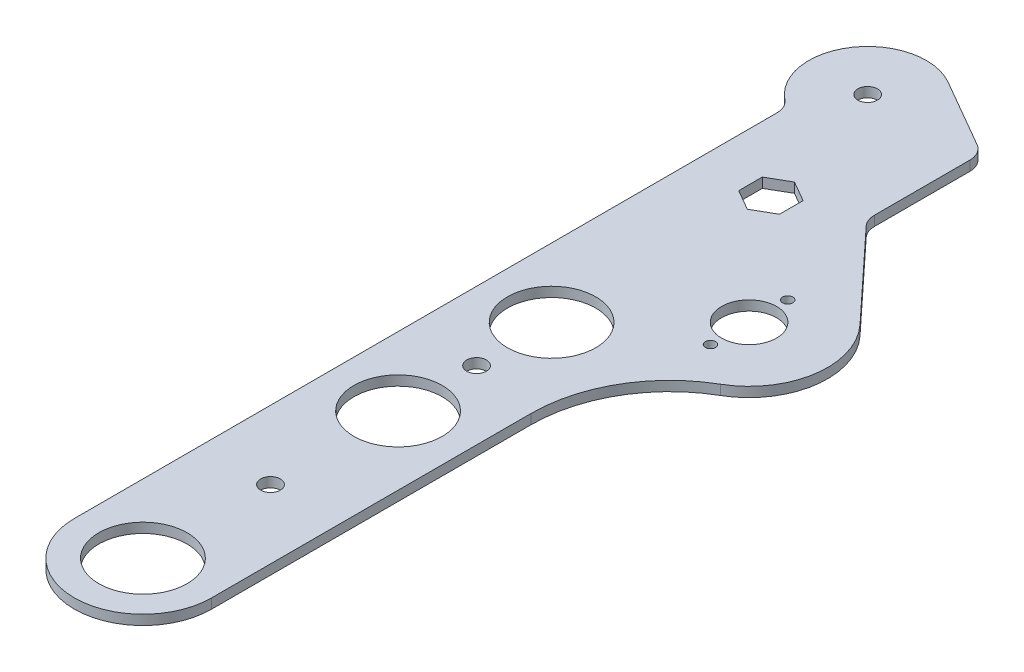
ISO-10303-21;
HEADER;
FILE_DESCRIPTION(('STEP AP214'),'2;1');
FILE_NAME('part.step','',(''),(''),'','','');
FILE_SCHEMA(('AUTOMOTIVE_DESIGN { 1 0 10303 214 1 1 1 1 }'));
ENDSEC;
DATA;
#1=APPLICATION_CONTEXT('core data for automotive mechanical design processes');
#2=APPLICATION_PROTOCOL_DEFINITION('international standard','automotive_design',2000,#1);
#3=PRODUCT_CONTEXT('',#1,'mechanical');
#4=PRODUCT('Part','Part','',(#3));
#5=PRODUCT_RELATED_PRODUCT_CATEGORY('part','',(#4));
#6=PRODUCT_DEFINITION_FORMATION('','',#4);
#7=PRODUCT_DEFINITION_CONTEXT('part definition',#1,'design');
#8=PRODUCT_DEFINITION('design','',#6,#7);
#9=PRODUCT_DEFINITION_SHAPE('','',#8);
#10=(LENGTH_UNIT() NAMED_UNIT(*) SI_UNIT(.MILLI.,.METRE.));
#11=(NAMED_UNIT(*) PLANE_ANGLE_UNIT() SI_UNIT($,.RADIAN.));
#12=(NAMED_UNIT(*) SI_UNIT($,.STERADIAN.) SOLID_ANGLE_UNIT());
#13=UNCERTAINTY_MEASURE_WITH_UNIT(LENGTH_MEASURE(1.E-05),#10,'distance_accuracy_value','');
#14=(GEOMETRIC_REPRESENTATION_CONTEXT(3) GLOBAL_UNCERTAINTY_ASSIGNED_CONTEXT((#13)) GLOBAL_UNIT_ASSIGNED_CONTEXT((#10,
#11,#12)) REPRESENTATION_CONTEXT('',''));
#15=CARTESIAN_POINT('',(0.,0.,0.));
#16=DIRECTION('',(0.,0.,1.));
#17=DIRECTION('',(1.,0.,0.));
#18=AXIS2_PLACEMENT_3D('',#15,#16,#17);
#19=CARTESIAN_POINT('',(2.25425,3.175,-3.90447553296214));
#20=DIRECTION('',(0.5,0.,-0.866025403784439));
#21=DIRECTION('',(-0.866025403784439,0.,-0.5));
#22=AXIS2_PLACEMENT_3D('',#19,#20,#21);
#23=PLANE('',#22);
#24=DIRECTION('',(0.866025403784439,0.,0.5));
#25=VECTOR('',#24,1.);
#26=CARTESIAN_POINT('',(2.25425,0.,-3.90447553296214));
#27=LINE('',#26,#25);
#28=CARTESIAN_POINT('',(15.621,0.,3.81282117772829));
#29=VERTEX_POINT('',#28);
#30=CARTESIAN_POINT('',(22.225,0.,7.62564235545658));
#31=VERTEX_POINT('',#30);
#32=EDGE_CURVE('E291',#29,#31,#27,.T.);
#33=ORIENTED_EDGE('',*,*,#32,.F.);
#34=DIRECTION('',(0.,-1.,0.));
#35=VECTOR('',#34,1.);
#36=CARTESIAN_POINT('',(15.621,3.175,3.81282117772829));
#37=LINE('',#36,#35);
#38=CARTESIAN_POINT('',(15.621,3.175,3.81282117772829));
#39=VERTEX_POINT('',#38);
#40=EDGE_CURVE('E11',#39,#29,#37,.T.);
#41=ORIENTED_EDGE('',*,*,#40,.F.);
#42=DIRECTION('',(0.866025403784439,0.,0.5));
#43=VECTOR('',#42,1.);
#44=CARTESIAN_POINT('',(2.25425,3.175,-3.90447553296214));
#45=LINE('',#44,#43);
#46=CARTESIAN_POINT('',(22.225,3.175,7.62564235545658));
#47=VERTEX_POINT('',#46);
#48=EDGE_CURVE('E673',#39,#47,#45,.T.);
#49=ORIENTED_EDGE('',*,*,#48,.T.);
#50=DIRECTION('',(0.,-1.,0.));
#51=VECTOR('',#50,1.);
#52=CARTESIAN_POINT('',(22.225,3.175,7.62564235545658));
#53=LINE('',#52,#51);
#54=EDGE_CURVE('E61',#47,#31,#53,.T.);
#55=ORIENTED_EDGE('',*,*,#54,.T.);
#56=EDGE_LOOP('',(#33,#41,#49,#55));
#57=FACE_BOUND('',#56,.T.);
#58=ADVANCED_FACE('F41',(#57),#23,.T.);
#59=CARTESIAN_POINT('',(15.621,3.175,0.));
#60=DIRECTION('',(1.,0.,0.));
#61=DIRECTION('',(0.,0.,-1.));
#62=AXIS2_PLACEMENT_3D('',#59,#60,#61);
#63=PLANE('',#62);
#64=DIRECTION('',(0.,0.,1.));
#65=VECTOR('',#64,1.);
#66=CARTESIAN_POINT('',(15.621,0.,0.));
#67=LINE('',#66,#65);
#68=CARTESIAN_POINT('',(15.621,0.,-3.81282117772829));
#69=VERTEX_POINT('',#68);
#70=EDGE_CURVE('E294',#69,#29,#67,.T.);
#71=ORIENTED_EDGE('',*,*,#70,.F.);
#72=DIRECTION('',(0.,-1.,0.));
#73=VECTOR('',#72,1.);
#74=CARTESIAN_POINT('',(15.621,3.175,-3.81282117772829));
#75=LINE('',#74,#73);
#76=CARTESIAN_POINT('',(15.621,3.175,-3.81282117772829));
#77=VERTEX_POINT('',#76);
#78=EDGE_CURVE('E52',#77,#69,#75,.T.);
#79=ORIENTED_EDGE('',*,*,#78,.F.);
#80=DIRECTION('',(0.,0.,1.));
#81=VECTOR('',#80,1.);
#82=CARTESIAN_POINT('',(15.621,3.175,0.));
#83=LINE('',#82,#81);
#84=EDGE_CURVE('E675',#77,#39,#83,.T.);
#85=ORIENTED_EDGE('',*,*,#84,.T.);
#86=ORIENTED_EDGE('',*,*,#40,.T.);
#87=EDGE_LOOP('',(#71,#79,#85,#86));
#88=FACE_BOUND('',#87,.T.);
#89=ADVANCED_FACE('F424',(#88),#63,.T.);
#90=CARTESIAN_POINT('',(2.25425,3.175,3.90447553296214));
#91=DIRECTION('',(0.5,0.,0.866025403784439));
#92=DIRECTION('',(0.866025403784439,0.,-0.5));
#93=AXIS2_PLACEMENT_3D('',#90,#91,#92);
#94=PLANE('',#93);
#95=DIRECTION('',(-0.866025403784439,0.,0.5));
#96=VECTOR('',#95,1.);
#97=CARTESIAN_POINT('',(2.25425,0.,3.90447553296214));
#98=LINE('',#97,#96);
#99=CARTESIAN_POINT('',(22.225,0.,-7.62564235545658));
#100=VERTEX_POINT('',#99);
#101=EDGE_CURVE('E298',#100,#69,#98,.T.);
#102=ORIENTED_EDGE('',*,*,#101,.F.);
#103=DIRECTION('',(0.,-1.,0.));
#104=VECTOR('',#103,1.);
#105=CARTESIAN_POINT('',(22.225,3.175,-7.62564235545658));
#106=LINE('',#105,#104);
#107=CARTESIAN_POINT('',(22.225,3.175,-7.62564235545658));
#108=VERTEX_POINT('',#107);
#109=EDGE_CURVE('E184',#108,#100,#106,.T.);
#110=ORIENTED_EDGE('',*,*,#109,.F.);
#111=DIRECTION('',(-0.866025403784439,0.,0.5));
#112=VECTOR('',#111,1.);
#113=CARTESIAN_POINT('',(2.25425,3.175,3.90447553296214));
#114=LINE('',#113,#112);
#115=EDGE_CURVE('E195',#108,#77,#114,.T.);
#116=ORIENTED_EDGE('',*,*,#115,.T.);
#117=ORIENTED_EDGE('',*,*,#78,.T.);
#118=EDGE_LOOP('',(#102,#110,#116,#117));
#119=FACE_BOUND('',#118,.T.);
#120=ADVANCED_FACE('F429',(#119),#94,.T.);
#121=CARTESIAN_POINT('',(8.85825000000001,3.175,-15.342939066147));
#122=DIRECTION('',(-0.5,0.,0.866025403784438));
#123=DIRECTION('',(0.866025403784439,0.,0.5));
#124=AXIS2_PLACEMENT_3D('',#121,#122,#123);
#125=PLANE('',#124);
#126=DIRECTION('',(-0.866025403784439,0.,-0.5));
#127=VECTOR('',#126,1.);
#128=CARTESIAN_POINT('',(8.85825000000001,0.,-15.342939066147));
#129=LINE('',#128,#127);
#130=CARTESIAN_POINT('',(28.829,0.,-3.81282117772829));
#131=VERTEX_POINT('',#130);
#132=EDGE_CURVE('E179',#131,#100,#129,.T.);
#133=ORIENTED_EDGE('',*,*,#132,.F.);
#134=DIRECTION('',(0.,-1.,0.));
#135=VECTOR('',#134,1.);
#136=CARTESIAN_POINT('',(28.829,3.175,-3.81282117772829));
#137=LINE('',#136,#135);
#138=CARTESIAN_POINT('',(28.829,3.175,-3.81282117772829));
#139=VERTEX_POINT('',#138);
#140=EDGE_CURVE('E174',#139,#131,#137,.T.);
#141=ORIENTED_EDGE('',*,*,#140,.F.);
#142=DIRECTION('',(-0.866025403784439,0.,-0.5));
#143=VECTOR('',#142,1.);
#144=CARTESIAN_POINT('',(8.85825000000001,3.175,-15.342939066147));
#145=LINE('',#144,#143);
#146=EDGE_CURVE('E177',#139,#108,#145,.T.);
#147=ORIENTED_EDGE('',*,*,#146,.T.);
#148=ORIENTED_EDGE('',*,*,#109,.T.);
#149=EDGE_LOOP('',(#133,#141,#147,#148));
#150=FACE_BOUND('',#149,.T.);
#151=ADVANCED_FACE('F176',(#150),#125,.T.);
#152=CARTESIAN_POINT('',(28.829,3.175,0.));
#153=DIRECTION('',(-1.,0.,0.));
#154=DIRECTION('',(0.,0.,1.));
#155=AXIS2_PLACEMENT_3D('',#152,#153,#154);
#156=PLANE('',#155);
#157=DIRECTION('',(0.,0.,-1.));
#158=VECTOR('',#157,1.);
#159=CARTESIAN_POINT('',(28.829,0.,0.));
#160=LINE('',#159,#158);
#161=CARTESIAN_POINT('',(28.829,0.,3.81282117772829));
#162=VERTEX_POINT('',#161);
#163=EDGE_CURVE('E304',#162,#131,#160,.T.);
#164=ORIENTED_EDGE('',*,*,#163,.F.);
#165=DIRECTION('',(0.,-1.,0.));
#166=VECTOR('',#165,1.);
#167=CARTESIAN_POINT('',(28.829,3.175,3.81282117772829));
#168=LINE('',#167,#166);
#169=CARTESIAN_POINT('',(28.829,3.175,3.81282117772829));
#170=VERTEX_POINT('',#169);
#171=EDGE_CURVE('E116',#170,#162,#168,.T.);
#172=ORIENTED_EDGE('',*,*,#171,.F.);
#173=DIRECTION('',(0.,0.,-1.));
#174=VECTOR('',#173,1.);
#175=CARTESIAN_POINT('',(28.829,3.175,0.));
#176=LINE('',#175,#174);
#177=EDGE_CURVE('E192',#170,#139,#176,.T.);
#178=ORIENTED_EDGE('',*,*,#177,.T.);
#179=ORIENTED_EDGE('',*,*,#140,.T.);
#180=EDGE_LOOP('',(#164,#172,#178,#179));
#181=FACE_BOUND('',#180,.T.);
#182=ADVANCED_FACE('F198',(#181),#156,.T.);
#183=CARTESIAN_POINT('',(50.8,3.175,-11.2344473454038));
#184=DIRECTION('',(0.,-1.,0.));
#185=DIRECTION('',(0.,0.,-1.));
#186=AXIS2_PLACEMENT_3D('',#183,#184,#185);
#187=CYLINDRICAL_SURFACE('',#186,6.34999999999999);
#188=CARTESIAN_POINT('',(50.8,0.,-11.2344473454038));
#189=DIRECTION('',(0.,1.,0.));
#190=DIRECTION('',(0.,0.,1.));
#191=AXIS2_PLACEMENT_3D('',#188,#189,#190);
#192=CIRCLE('',#191,6.34999999999999);
#193=CARTESIAN_POINT('',(44.45,0.,-11.2344473454038));
#194=VERTEX_POINT('',#193);
#195=CARTESIAN_POINT('',(46.1502533204846,0.,-6.90982530222635));
#196=VERTEX_POINT('',#195);
#197=EDGE_CURVE('E215',#194,#196,#192,.T.);
#198=ORIENTED_EDGE('',*,*,#197,.F.);
#199=DIRECTION('',(0.,-1.,0.));
#200=VECTOR('',#199,1.);
#201=CARTESIAN_POINT('',(44.45,3.175,-11.2344473454038));
#202=LINE('',#201,#200);
#203=CARTESIAN_POINT('',(44.45,3.175,-11.2344473454038));
#204=VERTEX_POINT('',#203);
#205=EDGE_CURVE('E45',#204,#194,#202,.T.);
#206=ORIENTED_EDGE('',*,*,#205,.F.);
#207=CARTESIAN_POINT('',(50.8,3.175,-11.2344473454038));
#208=DIRECTION('',(0.,1.,0.));
#209=DIRECTION('',(0.,0.,1.));
#210=AXIS2_PLACEMENT_3D('',#207,#208,#209);
#211=CIRCLE('',#210,6.34999999999999);
#212=CARTESIAN_POINT('',(46.1502533204846,3.175,-6.90982530222635));
#213=VERTEX_POINT('',#212);
#214=EDGE_CURVE('E367',#204,#213,#211,.T.);
#215=ORIENTED_EDGE('',*,*,#214,.T.);
#216=DIRECTION('',(0.,-1.,0.));
#217=VECTOR('',#216,1.);
#218=CARTESIAN_POINT('',(46.1502533204846,3.175,-6.90982530222635));
#219=LINE('',#218,#217);
#220=EDGE_CURVE('E203',#213,#196,#219,.T.);
#221=ORIENTED_EDGE('',*,*,#220,.T.);
#222=EDGE_LOOP('',(#198,#206,#215,#221));
#223=FACE_BOUND('',#222,.T.);
#224=ADVANCED_FACE('F365',(#223),#187,.F.);
#225=CARTESIAN_POINT('',(44.45,3.175,0.));
#226=DIRECTION('',(-1.,0.,0.));
#227=DIRECTION('',(0.,0.,1.));
#228=AXIS2_PLACEMENT_3D('',#225,#226,#227);
#229=PLANE('',#228);
#230=DIRECTION('',(0.,0.,-1.));
#231=VECTOR('',#230,1.);
#232=CARTESIAN_POINT('',(44.45,0.,0.));
#233=LINE('',#232,#231);
#234=CARTESIAN_POINT('',(44.45,0.,-42.1610034075734));
#235=VERTEX_POINT('',#234);
#236=EDGE_CURVE('E219',#194,#235,#233,.T.);
#237=ORIENTED_EDGE('',*,*,#236,.T.);
#238=DIRECTION('',(0.,-1.,0.));
#239=VECTOR('',#238,1.);
#240=CARTESIAN_POINT('',(44.45,3.175,-42.1610034075734));
#241=LINE('',#240,#239);
#242=CARTESIAN_POINT('',(44.45,3.175,-42.1610034075734));
#243=VERTEX_POINT('',#242);
#244=EDGE_CURVE('E350',#243,#235,#241,.T.);
#245=ORIENTED_EDGE('',*,*,#244,.F.);
#246=DIRECTION('',(0.,0.,-1.));
#247=VECTOR('',#246,1.);
#248=CARTESIAN_POINT('',(44.45,3.175,0.));
#249=LINE('',#248,#247);
#250=EDGE_CURVE('E360',#204,#243,#249,.T.);
#251=ORIENTED_EDGE('',*,*,#250,.F.);
#252=ORIENTED_EDGE('',*,*,#205,.T.);
#253=EDGE_LOOP('',(#237,#245,#251,#252));
#254=FACE_BOUND('',#253,.T.);
#255=ADVANCED_FACE('F359',(#254),#229,.F.);
#256=CARTESIAN_POINT('',(38.1,3.175,-42.1610034075734));
#257=DIRECTION('',(0.,-1.,0.));
#258=DIRECTION('',(0.,0.,-1.));
#259=AXIS2_PLACEMENT_3D('',#256,#257,#258);
#260=CYLINDRICAL_SURFACE('',#259,6.35);
#261=CARTESIAN_POINT('',(38.1,0.,-42.1610034075734));
#262=DIRECTION('',(0.,1.,0.));
#263=DIRECTION('',(0.,0.,1.));
#264=AXIS2_PLACEMENT_3D('',#261,#262,#263);
#265=CIRCLE('',#264,6.35);
#266=CARTESIAN_POINT('',(41.2749999999998,0.,-47.6602647216047));
#267=VERTEX_POINT('',#266);
#268=EDGE_CURVE('E223',#267,#235,#265,.F.);
#269=ORIENTED_EDGE('',*,*,#268,.F.);
#270=DIRECTION('',(0.,-1.,0.));
#271=VECTOR('',#270,1.);
#272=CARTESIAN_POINT('',(41.2749999999998,3.175,-47.6602647216047));
#273=LINE('',#272,#271);
#274=CARTESIAN_POINT('',(41.2749999999998,3.175,-47.6602647216047));
#275=VERTEX_POINT('',#274);
#276=EDGE_CURVE('E348',#275,#267,#273,.T.);
#277=ORIENTED_EDGE('',*,*,#276,.F.);
#278=CARTESIAN_POINT('',(38.1,3.175,-42.1610034075734));
#279=DIRECTION('',(0.,1.,0.));
#280=DIRECTION('',(0.,0.,1.));
#281=AXIS2_PLACEMENT_3D('',#278,#279,#280);
#282=CIRCLE('',#281,6.35);
#283=EDGE_CURVE('E733',#275,#243,#282,.F.);
#284=ORIENTED_EDGE('',*,*,#283,.T.);
#285=ORIENTED_EDGE('',*,*,#244,.T.);
#286=EDGE_LOOP('',(#269,#277,#284,#285));
#287=FACE_BOUND('',#286,.T.);
#288=ADVANCED_FACE('F413',(#287),#260,.T.);
#289=CARTESIAN_POINT('',(30.9562499999988,3.175,-53.6177978118054));
#290=DIRECTION('',(0.499999999999976,0.,-0.866025403784452));
#291=DIRECTION('',(-0.866025403784453,0.,-0.499999999999976));
#292=AXIS2_PLACEMENT_3D('',#289,#290,#291);
#293=PLANE('',#292);
#294=DIRECTION('',(0.866025403784452,0.,0.499999999999976));
#295=VECTOR('',#294,1.);
#296=CARTESIAN_POINT('',(30.9562499999988,0.,-53.6177978118054));
#297=LINE('',#296,#295);
#298=CARTESIAN_POINT('',(19.0499999999991,0.,-60.4918744543437));
#299=VERTEX_POINT('',#298);
#300=EDGE_CURVE('E227',#299,#267,#297,.T.);
#301=ORIENTED_EDGE('',*,*,#300,.F.);
#302=DIRECTION('',(0.,-1.,0.));
#303=VECTOR('',#302,1.);
#304=CARTESIAN_POINT('',(19.0499999999991,3.175,-60.4918744543437));
#305=LINE('',#304,#303);
#306=CARTESIAN_POINT('',(19.0499999999991,3.175,-60.4918744543437));
#307=VERTEX_POINT('',#306);
#308=EDGE_CURVE('E345',#307,#299,#305,.T.);
#309=ORIENTED_EDGE('',*,*,#308,.F.);
#310=DIRECTION('',(0.866025403784452,0.,0.499999999999976));
#311=VECTOR('',#310,1.);
#312=CARTESIAN_POINT('',(30.9562499999988,3.175,-53.6177978118054));
#313=LINE('',#312,#311);
#314=EDGE_CURVE('E411',#307,#275,#313,.T.);
#315=ORIENTED_EDGE('',*,*,#314,.T.);
#316=ORIENTED_EDGE('',*,*,#276,.T.);
#317=EDGE_LOOP('',(#301,#309,#315,#316));
#318=FACE_BOUND('',#317,.T.);
#319=ADVANCED_FACE('F407',(#318),#293,.T.);
#320=CARTESIAN_POINT('',(9.52499999999954,3.175,-43.9940905122499));
#321=DIRECTION('',(0.,-1.,0.));
#322=DIRECTION('',(0.,0.,-1.));
#323=AXIS2_PLACEMENT_3D('',#320,#321,#322);
#324=CYLINDRICAL_SURFACE('',#323,19.0499999999996);
#325=CARTESIAN_POINT('',(9.52499999999954,0.,-43.9940905122499));
#326=DIRECTION('',(0.,1.,0.));
#327=DIRECTION('',(0.,0.,1.));
#328=AXIS2_PLACEMENT_3D('',#325,#326,#327);
#329=CIRCLE('',#328,19.0499999999996);
#330=CARTESIAN_POINT('',(-2.38125000000024,0.,-29.1231890285641));
#331=VERTEX_POINT('',#330);
#332=EDGE_CURVE('E231',#299,#331,#329,.T.);
#333=ORIENTED_EDGE('',*,*,#332,.T.);
#334=DIRECTION('',(0.,-1.,0.));
#335=VECTOR('',#334,1.);
#336=CARTESIAN_POINT('',(-2.38125000000024,3.175,-29.1231890285641));
#337=LINE('',#336,#335);
#338=CARTESIAN_POINT('',(-2.38125000000024,3.175,-29.1231890285641));
#339=VERTEX_POINT('',#338);
#340=EDGE_CURVE('E342',#339,#331,#337,.T.);
#341=ORIENTED_EDGE('',*,*,#340,.F.);
#342=CARTESIAN_POINT('',(9.52499999999954,3.175,-43.9940905122499));
#343=DIRECTION('',(0.,1.,0.));
#344=DIRECTION('',(0.,0.,1.));
#345=AXIS2_PLACEMENT_3D('',#342,#343,#344);
#346=CIRCLE('',#345,19.0499999999996);
#347=EDGE_CURVE('E728',#307,#339,#346,.T.);
#348=ORIENTED_EDGE('',*,*,#347,.F.);
#349=ORIENTED_EDGE('',*,*,#308,.T.);
#350=EDGE_LOOP('',(#333,#341,#348,#349));
#351=FACE_BOUND('',#350,.T.);
#352=ADVANCED_FACE('F420',(#351),#324,.T.);
#353=CARTESIAN_POINT('',(-6.35000000000001,3.175,-24.1662218673356));
#354=DIRECTION('',(0.,-1.,0.));
#355=DIRECTION('',(0.,0.,-1.));
#356=AXIS2_PLACEMENT_3D('',#353,#354,#355);
#357=CYLINDRICAL_SURFACE('',#356,6.35);
#358=CARTESIAN_POINT('',(-6.35000000000001,0.,-24.1662218673356));
#359=DIRECTION('',(0.,1.,0.));
#360=DIRECTION('',(0.,0.,1.));
#361=AXIS2_PLACEMENT_3D('',#358,#359,#360);
#362=CIRCLE('',#361,6.35);
#363=CARTESIAN_POINT('',(0.,0.,-24.1662218673356));
#364=VERTEX_POINT('',#363);
#365=EDGE_CURVE('E235',#364,#331,#362,.T.);
#366=ORIENTED_EDGE('',*,*,#365,.F.);
#367=DIRECTION('',(0.,-1.,0.));
#368=VECTOR('',#367,1.);
#369=CARTESIAN_POINT('',(0.,3.175,-24.1662218673356));
#370=LINE('',#369,#368);
#371=CARTESIAN_POINT('',(0.,3.175,-24.1662218673356));
#372=VERTEX_POINT('',#371);
#373=EDGE_CURVE('E339',#372,#364,#370,.T.);
#374=ORIENTED_EDGE('',*,*,#373,.F.);
#375=CARTESIAN_POINT('',(-6.35000000000001,3.175,-24.1662218673356));
#376=DIRECTION('',(0.,1.,0.));
#377=DIRECTION('',(0.,0.,1.));
#378=AXIS2_PLACEMENT_3D('',#375,#376,#377);
#379=CIRCLE('',#378,6.35);
#380=EDGE_CURVE('E401',#372,#339,#379,.T.);
#381=ORIENTED_EDGE('',*,*,#380,.T.);
#382=ORIENTED_EDGE('',*,*,#340,.T.);
#383=EDGE_LOOP('',(#366,#374,#381,#382));
#384=FACE_BOUND('',#383,.T.);
#385=ADVANCED_FACE('F400',(#384),#357,.F.);
#386=CARTESIAN_POINT('',(0.,3.175,0.));
#387=DIRECTION('',(1.,0.,0.));
#388=DIRECTION('',(0.,0.,-1.));
#389=AXIS2_PLACEMENT_3D('',#386,#387,#388);
#390=PLANE('',#389);
#391=DIRECTION('',(0.,0.,1.));
#392=VECTOR('',#391,1.);
#393=CARTESIAN_POINT('',(0.,0.,0.));
#394=LINE('',#393,#392);
#395=CARTESIAN_POINT('',(0.,0.,203.2));
#396=VERTEX_POINT('',#395);
#397=EDGE_CURVE('E239',#364,#396,#394,.T.);
#398=ORIENTED_EDGE('',*,*,#397,.T.);
#399=DIRECTION('',(0.,-1.,0.));
#400=VECTOR('',#399,1.);
#401=CARTESIAN_POINT('',(0.,3.175,203.2));
#402=LINE('',#401,#400);
#403=CARTESIAN_POINT('',(0.,3.175,203.2));
#404=VERTEX_POINT('',#403);
#405=EDGE_CURVE('E335',#404,#396,#402,.T.);
#406=ORIENTED_EDGE('',*,*,#405,.F.);
#407=DIRECTION('',(0.,0.,1.));
#408=VECTOR('',#407,1.);
#409=CARTESIAN_POINT('',(0.,3.175,0.));
#410=LINE('',#409,#408);
#411=EDGE_CURVE('E396',#372,#404,#410,.T.);
#412=ORIENTED_EDGE('',*,*,#411,.F.);
#413=ORIENTED_EDGE('',*,*,#373,.T.);
#414=EDGE_LOOP('',(#398,#406,#412,#413));
#415=FACE_BOUND('',#414,.T.);
#416=ADVANCED_FACE('F395',(#415),#390,.F.);
#417=CARTESIAN_POINT('',(22.225,3.175,203.2));
#418=DIRECTION('',(0.,-1.,0.));
#419=DIRECTION('',(0.,0.,-1.));
#420=AXIS2_PLACEMENT_3D('',#417,#418,#419);
#421=CYLINDRICAL_SURFACE('',#420,22.225);
#422=CARTESIAN_POINT('',(22.225,0.,203.2));
#423=DIRECTION('',(0.,1.,0.));
#424=DIRECTION('',(0.,0.,1.));
#425=AXIS2_PLACEMENT_3D('',#422,#423,#424);
#426=CIRCLE('',#425,22.225);
#427=CARTESIAN_POINT('',(44.45,0.,203.2));
#428=VERTEX_POINT('',#427);
#429=EDGE_CURVE('E243',#396,#428,#426,.T.);
#430=ORIENTED_EDGE('',*,*,#429,.T.);
#431=DIRECTION('',(0.,-1.,0.));
#432=VECTOR('',#431,1.);
#433=CARTESIAN_POINT('',(44.45,3.175,203.2));
#434=LINE('',#433,#432);
#435=CARTESIAN_POINT('',(44.45,3.175,203.2));
#436=VERTEX_POINT('',#435);
#437=EDGE_CURVE('E332',#436,#428,#434,.T.);
#438=ORIENTED_EDGE('',*,*,#437,.F.);
#439=CARTESIAN_POINT('',(22.225,3.175,203.2));
#440=DIRECTION('',(0.,1.,0.));
#441=DIRECTION('',(0.,0.,1.));
#442=AXIS2_PLACEMENT_3D('',#439,#440,#441);
#443=CIRCLE('',#442,22.225);
#444=EDGE_CURVE('E391',#404,#436,#443,.T.);
#445=ORIENTED_EDGE('',*,*,#444,.F.);
#446=ORIENTED_EDGE('',*,*,#405,.T.);
#447=EDGE_LOOP('',(#430,#438,#445,#446));
#448=FACE_BOUND('',#447,.T.);
#449=ADVANCED_FACE('F390',(#448),#421,.T.);
#450=CARTESIAN_POINT('',(44.4499999999999,3.175,0.));
#451=DIRECTION('',(1.,0.,0.));
#452=DIRECTION('',(0.,0.,-1.));
#453=AXIS2_PLACEMENT_3D('',#450,#451,#452);
#454=PLANE('',#453);
#455=DIRECTION('',(0.,0.,1.));
#456=VECTOR('',#455,1.);
#457=CARTESIAN_POINT('',(44.4499999999999,0.,0.));
#458=LINE('',#457,#456);
#459=CARTESIAN_POINT('',(44.45,0.,99.8571666408903));
#460=VERTEX_POINT('',#459);
#461=EDGE_CURVE('E247',#460,#428,#458,.T.);
#462=ORIENTED_EDGE('',*,*,#461,.F.);
#463=DIRECTION('',(0.,-1.,0.));
#464=VECTOR('',#463,1.);
#465=CARTESIAN_POINT('',(44.45,3.175,99.8571666408903));
#466=LINE('',#465,#464);
#467=CARTESIAN_POINT('',(44.45,3.175,99.8571666408903));
#468=VERTEX_POINT('',#467);
#469=EDGE_CURVE('E329',#468,#460,#466,.T.);
#470=ORIENTED_EDGE('',*,*,#469,.F.);
#471=DIRECTION('',(0.,0.,1.));
#472=VECTOR('',#471,1.);
#473=CARTESIAN_POINT('',(44.4499999999999,3.175,0.));
#474=LINE('',#473,#472);
#475=EDGE_CURVE('E719',#468,#436,#474,.T.);
#476=ORIENTED_EDGE('',*,*,#475,.T.);
#477=ORIENTED_EDGE('',*,*,#437,.T.);
#478=EDGE_LOOP('',(#462,#470,#476,#477));
#479=FACE_BOUND('',#478,.T.);
#480=ADVANCED_FACE('F384',(#479),#454,.T.);
#481=CARTESIAN_POINT('',(89.3035025575279,3.175,99.8571666408903));
#482=DIRECTION('',(0.,-1.,0.));
#483=DIRECTION('',(0.,0.,-1.));
#484=AXIS2_PLACEMENT_3D('',#481,#482,#483);
#485=CYLINDRICAL_SURFACE('',#484,44.8535025575279);
#486=CARTESIAN_POINT('',(89.3035025575279,0.,99.8571666408903));
#487=DIRECTION('',(0.,1.,0.));
#488=DIRECTION('',(0.,0.,1.));
#489=AXIS2_PLACEMENT_3D('',#486,#487,#488);
#490=CIRCLE('',#489,44.8535025575279);
#491=CARTESIAN_POINT('',(66.876751278764,0.,61.0128939773608));
#492=VERTEX_POINT('',#491);
#493=EDGE_CURVE('E251',#492,#460,#490,.T.);
#494=ORIENTED_EDGE('',*,*,#493,.F.);
#495=DIRECTION('',(0.,-1.,0.));
#496=VECTOR('',#495,1.);
#497=CARTESIAN_POINT('',(66.876751278764,3.175,61.0128939773608));
#498=LINE('',#497,#496);
#499=CARTESIAN_POINT('',(66.876751278764,3.175,61.0128939773608));
#500=VERTEX_POINT('',#499);
#501=EDGE_CURVE('E326',#500,#492,#498,.T.);
#502=ORIENTED_EDGE('',*,*,#501,.F.);
#503=CARTESIAN_POINT('',(89.3035025575279,3.175,99.8571666408903));
#504=DIRECTION('',(0.,1.,0.));
#505=DIRECTION('',(0.,0.,1.));
#506=AXIS2_PLACEMENT_3D('',#503,#504,#505);
#507=CIRCLE('',#506,44.8535025575279);
#508=EDGE_CURVE('E380',#500,#468,#507,.T.);
#509=ORIENTED_EDGE('',*,*,#508,.T.);
#510=ORIENTED_EDGE('',*,*,#469,.T.);
#511=EDGE_LOOP('',(#494,#502,#509,#510));
#512=FACE_BOUND('',#511,.T.);
#513=ADVANCED_FACE('F375',(#512),#485,.F.);
#514=CARTESIAN_POINT('',(54.1767512787641,3.175,39.015848721236));
#515=DIRECTION('',(0.,-1.,0.));
#516=DIRECTION('',(0.,0.,-1.));
#517=AXIS2_PLACEMENT_3D('',#514,#515,#516);
#518=CYLINDRICAL_SURFACE('',#517,25.4);
#519=CARTESIAN_POINT('',(54.1767512787641,0.,39.015848721236));
#520=DIRECTION('',(0.,1.,0.));
#521=DIRECTION('',(0.,0.,1.));
#522=AXIS2_PLACEMENT_3D('',#519,#520,#521);
#523=CIRCLE('',#522,25.4);
#524=CARTESIAN_POINT('',(72.7757379968254,0.,21.7173605485263));
#525=VERTEX_POINT('',#524);
#526=EDGE_CURVE('E255',#492,#525,#523,.T.);
#527=ORIENTED_EDGE('',*,*,#526,.T.);
#528=DIRECTION('',(0.,-1.,0.));
#529=VECTOR('',#528,1.);
#530=CARTESIAN_POINT('',(72.7757379968254,3.175,21.7173605485263));
#531=LINE('',#530,#529);
#532=CARTESIAN_POINT('',(72.7757379968254,3.175,21.7173605485263));
#533=VERTEX_POINT('',#532);
#534=EDGE_CURVE('E322',#533,#525,#531,.T.);
#535=ORIENTED_EDGE('',*,*,#534,.F.);
#536=CARTESIAN_POINT('',(54.1767512787641,3.175,39.015848721236));
#537=DIRECTION('',(0.,1.,0.));
#538=DIRECTION('',(0.,0.,1.));
#539=AXIS2_PLACEMENT_3D('',#536,#537,#538);
#540=CIRCLE('',#539,25.4);
#541=EDGE_CURVE('E713',#500,#533,#540,.T.);
#542=ORIENTED_EDGE('',*,*,#541,.F.);
#543=ORIENTED_EDGE('',*,*,#501,.T.);
#544=EDGE_LOOP('',(#527,#535,#542,#543));
#545=FACE_BOUND('',#544,.T.);
#546=ADVANCED_FACE('F438',(#545),#518,.T.);
#547=CARTESIAN_POINT('',(22.225,3.175,203.2));
#548=DIRECTION('',(0.,-1.,0.));
#549=DIRECTION('',(0.,0.,-1.));
#550=AXIS2_PLACEMENT_3D('',#547,#548,#549);
#551=CYLINDRICAL_SURFACE('',#550,14.2875);
#552=CARTESIAN_POINT('',(22.225,3.175,203.2));
#553=DIRECTION('',(0.,1.,0.));
#554=DIRECTION('',(0.,0.,1.));
#555=AXIS2_PLACEMENT_3D('',#552,#553,#554);
#556=CIRCLE('',#555,14.2875);
#557=CARTESIAN_POINT('',(22.225,3.175,217.4875));
#558=VERTEX_POINT('',#557);
#559=EDGE_CURVE('E677',#558,#558,#556,.T.);
#560=ORIENTED_EDGE('',*,*,#559,.T.);
#561=EDGE_LOOP('',(#560));
#562=FACE_BOUND('',#561,.T.);
#563=CARTESIAN_POINT('',(22.225,0.,203.2));
#564=DIRECTION('',(0.,1.,0.));
#565=DIRECTION('',(0.,0.,1.));
#566=AXIS2_PLACEMENT_3D('',#563,#564,#565);
#567=CIRCLE('',#566,14.2875);
#568=CARTESIAN_POINT('',(22.225,0.,217.4875));
#569=VERTEX_POINT('',#568);
#570=EDGE_CURVE('E287',#569,#569,#567,.T.);
#571=ORIENTED_EDGE('',*,*,#570,.F.);
#572=EDGE_LOOP('',(#571));
#573=FACE_BOUND('',#572,.T.);
#574=ADVANCED_FACE('F434',(#562,#573),#551,.F.);
#575=CARTESIAN_POINT('',(22.225,3.175,120.65));
#576=DIRECTION('',(0.,-1.,0.));
#577=DIRECTION('',(0.,0.,-1.));
#578=AXIS2_PLACEMENT_3D('',#575,#576,#577);
#579=CYLINDRICAL_SURFACE('',#578,14.2875);
#580=CARTESIAN_POINT('',(22.225,3.175,120.65));
#581=DIRECTION('',(0.,1.,0.));
#582=DIRECTION('',(0.,0.,1.));
#583=AXIS2_PLACEMENT_3D('',#580,#581,#582);
#584=CIRCLE('',#583,14.2875);
#585=CARTESIAN_POINT('',(22.225,3.175,134.9375));
#586=VERTEX_POINT('',#585);
#587=EDGE_CURVE('E686',#586,#586,#584,.T.);
#588=ORIENTED_EDGE('',*,*,#587,.T.);
#589=EDGE_LOOP('',(#588));
#590=FACE_BOUND('',#589,.T.);
#591=CARTESIAN_POINT('',(22.225,0.,120.65));
#592=DIRECTION('',(0.,1.,0.));
#593=DIRECTION('',(0.,0.,1.));
#594=AXIS2_PLACEMENT_3D('',#591,#592,#593);
#595=CIRCLE('',#594,14.2875);
#596=CARTESIAN_POINT('',(22.225,0.,134.9375));
#597=VERTEX_POINT('',#596);
#598=EDGE_CURVE('E283',#597,#597,#595,.T.);
#599=ORIENTED_EDGE('',*,*,#598,.F.);
#600=EDGE_LOOP('',(#599));
#601=FACE_BOUND('',#600,.T.);
#602=ADVANCED_FACE('F437',(#590,#601),#579,.F.);
#603=CARTESIAN_POINT('',(22.225,3.175,70.9676));
#604=DIRECTION('',(0.,-1.,0.));
#605=DIRECTION('',(0.,0.,-1.));
#606=AXIS2_PLACEMENT_3D('',#603,#604,#605);
#607=CYLINDRICAL_SURFACE('',#606,14.2875);
#608=CARTESIAN_POINT('',(22.225,3.175,70.9676));
#609=DIRECTION('',(0.,1.,0.));
#610=DIRECTION('',(0.,0.,1.));
#611=AXIS2_PLACEMENT_3D('',#608,#609,#610);
#612=CIRCLE('',#611,14.2875);
#613=CARTESIAN_POINT('',(22.225,3.175,85.2551));
#614=VERTEX_POINT('',#613);
#615=EDGE_CURVE('E690',#614,#614,#612,.T.);
#616=ORIENTED_EDGE('',*,*,#615,.T.);
#617=EDGE_LOOP('',(#616));
#618=FACE_BOUND('',#617,.T.);
#619=CARTESIAN_POINT('',(22.225,0.,70.9676));
#620=DIRECTION('',(0.,1.,0.));
#621=DIRECTION('',(0.,0.,1.));
#622=AXIS2_PLACEMENT_3D('',#619,#620,#621);
#623=CIRCLE('',#622,14.2875);
#624=CARTESIAN_POINT('',(22.225,0.,85.2551));
#625=VERTEX_POINT('',#624);
#626=EDGE_CURVE('E279',#625,#625,#623,.T.);
#627=ORIENTED_EDGE('',*,*,#626,.F.);
#628=EDGE_LOOP('',(#627));
#629=FACE_BOUND('',#628,.T.);
#630=ADVANCED_FACE('F442',(#618,#629),#607,.F.);
#631=CARTESIAN_POINT('',(22.2250000000001,3.175,95.25));
#632=DIRECTION('',(0.,-1.,0.));
#633=DIRECTION('',(0.,0.,-1.));
#634=AXIS2_PLACEMENT_3D('',#631,#632,#633);
#635=CYLINDRICAL_SURFACE('',#634,3.175);
#636=CARTESIAN_POINT('',(22.2250000000001,3.175,95.25));
#637=DIRECTION('',(0.,1.,0.));
#638=DIRECTION('',(0.,0.,1.));
#639=AXIS2_PLACEMENT_3D('',#636,#637,#638);
#640=CIRCLE('',#639,3.175);
#641=CARTESIAN_POINT('',(22.2250000000001,3.175,98.425));
#642=VERTEX_POINT('',#641);
#643=EDGE_CURVE('E694',#642,#642,#640,.T.);
#644=ORIENTED_EDGE('',*,*,#643,.T.);
#645=EDGE_LOOP('',(#644));
#646=FACE_BOUND('',#645,.T.);
#647=CARTESIAN_POINT('',(22.2250000000001,0.,95.25));
#648=DIRECTION('',(0.,1.,0.));
#649=DIRECTION('',(0.,0.,1.));
#650=AXIS2_PLACEMENT_3D('',#647,#648,#649);
#651=CIRCLE('',#650,3.175);
#652=CARTESIAN_POINT('',(22.2250000000001,0.,98.425));
#653=VERTEX_POINT('',#652);
#654=EDGE_CURVE('E275',#653,#653,#651,.T.);
#655=ORIENTED_EDGE('',*,*,#654,.F.);
#656=EDGE_LOOP('',(#655));
#657=FACE_BOUND('',#656,.T.);
#658=ADVANCED_FACE('F446',(#646,#657),#635,.F.);
#659=CARTESIAN_POINT('',(22.2250000000002,3.175,161.925));
#660=DIRECTION('',(0.,-1.,0.));
#661=DIRECTION('',(0.,0.,-1.));
#662=AXIS2_PLACEMENT_3D('',#659,#660,#661);
#663=CYLINDRICAL_SURFACE('',#662,3.175);
#664=CARTESIAN_POINT('',(22.2250000000002,3.175,161.925));
#665=DIRECTION('',(0.,1.,0.));
#666=DIRECTION('',(0.,0.,1.));
#667=AXIS2_PLACEMENT_3D('',#664,#665,#666);
#668=CIRCLE('',#667,3.175);
#669=CARTESIAN_POINT('',(22.2250000000002,3.175,165.1));
#670=VERTEX_POINT('',#669);
#671=EDGE_CURVE('E698',#670,#670,#668,.T.);
#672=ORIENTED_EDGE('',*,*,#671,.T.);
#673=EDGE_LOOP('',(#672));
#674=FACE_BOUND('',#673,.T.);
#675=CARTESIAN_POINT('',(22.2250000000002,0.,161.925));
#676=DIRECTION('',(0.,1.,0.));
#677=DIRECTION('',(0.,0.,1.));
#678=AXIS2_PLACEMENT_3D('',#675,#676,#677);
#679=CIRCLE('',#678,3.175);
#680=CARTESIAN_POINT('',(22.2250000000002,0.,165.1));
#681=VERTEX_POINT('',#680);
#682=EDGE_CURVE('E271',#681,#681,#679,.T.);
#683=ORIENTED_EDGE('',*,*,#682,.F.);
#684=EDGE_LOOP('',(#683));
#685=FACE_BOUND('',#684,.T.);
#686=ADVANCED_FACE('F450',(#674,#685),#663,.F.);
#687=CARTESIAN_POINT('',(9.52499999999954,3.175,-43.9940905122499));
#688=DIRECTION('',(0.,-1.,0.));
#689=DIRECTION('',(0.,0.,-1.));
#690=AXIS2_PLACEMENT_3D('',#687,#688,#689);
#691=CYLINDRICAL_SURFACE('',#690,3.17500000000002);
#692=CARTESIAN_POINT('',(9.52499999999954,3.175,-43.9940905122499));
#693=DIRECTION('',(0.,1.,0.));
#694=DIRECTION('',(0.,0.,1.));
#695=AXIS2_PLACEMENT_3D('',#692,#693,#694);
#696=CIRCLE('',#695,3.17500000000002);
#697=CARTESIAN_POINT('',(9.52499999999954,3.175,-40.8190905122499));
#698=VERTEX_POINT('',#697);
#699=EDGE_CURVE('E702',#698,#698,#696,.T.);
#700=ORIENTED_EDGE('',*,*,#699,.T.);
#701=EDGE_LOOP('',(#700));
#702=FACE_BOUND('',#701,.T.);
#703=CARTESIAN_POINT('',(9.52499999999954,0.,-43.9940905122499));
#704=DIRECTION('',(0.,1.,0.));
#705=DIRECTION('',(0.,0.,1.));
#706=AXIS2_PLACEMENT_3D('',#703,#704,#705);
#707=CIRCLE('',#706,3.17500000000002);
#708=CARTESIAN_POINT('',(9.52499999999954,0.,-40.8190905122499));
#709=VERTEX_POINT('',#708);
#710=EDGE_CURVE('E267',#709,#709,#707,.T.);
#711=ORIENTED_EDGE('',*,*,#710,.F.);
#712=EDGE_LOOP('',(#711));
#713=FACE_BOUND('',#712,.T.);
#714=ADVANCED_FACE('F454',(#702,#713),#691,.F.);
#715=CARTESIAN_POINT('',(54.1767512787641,3.175,39.015848721236));
#716=DIRECTION('',(0.,-1.,0.));
#717=DIRECTION('',(0.,0.,-1.));
#718=AXIS2_PLACEMENT_3D('',#715,#716,#717);
#719=CYLINDRICAL_SURFACE('',#718,8.88999999999999);
#720=CARTESIAN_POINT('',(54.1767512787641,3.175,39.015848721236));
#721=DIRECTION('',(0.,1.,0.));
#722=DIRECTION('',(0.,0.,1.));
#723=AXIS2_PLACEMENT_3D('',#720,#721,#722);
#724=CIRCLE('',#723,8.88999999999999);
#725=CARTESIAN_POINT('',(54.1767512787641,3.175,47.905848721236));
#726=VERTEX_POINT('',#725);
#727=EDGE_CURVE('E706',#726,#726,#724,.T.);
#728=ORIENTED_EDGE('',*,*,#727,.T.);
#729=EDGE_LOOP('',(#728));
#730=FACE_BOUND('',#729,.T.);
#731=CARTESIAN_POINT('',(54.1767512787641,0.,39.015848721236));
#732=DIRECTION('',(0.,1.,0.));
#733=DIRECTION('',(0.,0.,1.));
#734=AXIS2_PLACEMENT_3D('',#731,#732,#733);
#735=CIRCLE('',#734,8.88999999999999);
#736=CARTESIAN_POINT('',(54.1767512787641,0.,47.905848721236));
#737=VERTEX_POINT('',#736);
#738=EDGE_CURVE('E263',#737,#737,#735,.T.);
#739=ORIENTED_EDGE('',*,*,#738,.F.);
#740=EDGE_LOOP('',(#739));
#741=FACE_BOUND('',#740,.T.);
#742=ADVANCED_FACE('F458',(#730,#741),#719,.F.);
#743=CARTESIAN_POINT('',(28.1907282826853,3.175,-26.2195455682833));
#744=DIRECTION('',(-0.732243571577218,0.,0.681042841445265));
#745=DIRECTION('',(0.681042841445265,0.,0.732243571577218));
#746=AXIS2_PLACEMENT_3D('',#743,#744,#745);
#747=PLANE('',#746);
#748=DIRECTION('',(-0.681042841445265,0.,-0.732243571577218));
#749=VECTOR('',#748,1.);
#750=CARTESIAN_POINT('',(28.1907282826853,0.,-26.2195455682833));
#751=LINE('',#750,#749);
#752=EDGE_CURVE('E259',#525,#196,#751,.T.);
#753=ORIENTED_EDGE('',*,*,#752,.T.);
#754=ORIENTED_EDGE('',*,*,#220,.F.);
#755=DIRECTION('',(-0.681042841445265,0.,-0.732243571577218));
#756=VECTOR('',#755,1.);
#757=CARTESIAN_POINT('',(28.1907282826853,3.175,-26.2195455682833));
#758=LINE('',#757,#756);
#759=EDGE_CURVE('E710',#533,#213,#758,.T.);
#760=ORIENTED_EDGE('',*,*,#759,.F.);
#761=ORIENTED_EDGE('',*,*,#534,.T.);
#762=EDGE_LOOP('',(#753,#754,#760,#761));
#763=FACE_BOUND('',#762,.T.);
#764=ADVANCED_FACE('F369',(#763),#747,.F.);
#765=CARTESIAN_POINT('',(54.1767512787641,3.175,51.515848613236));
#766=DIRECTION('',(0.,-1.,0.));
#767=DIRECTION('',(0.,0.,-1.));
#768=AXIS2_PLACEMENT_3D('',#765,#766,#767);
#769=CYLINDRICAL_SURFACE('',#768,1.650000002);
#770=CARTESIAN_POINT('',(54.1767512787641,3.175,51.515848613236));
#771=DIRECTION('',(0.,1.,0.));
#772=DIRECTION('',(0.,0.,1.));
#773=AXIS2_PLACEMENT_3D('',#770,#771,#772);
#774=CIRCLE('',#773,1.650000002);
#775=CARTESIAN_POINT('',(54.1767512787641,3.175,53.165848615236));
#776=VERTEX_POINT('',#775);
#777=EDGE_CURVE('E740',#776,#776,#774,.T.);
#778=ORIENTED_EDGE('',*,*,#777,.T.);
#779=EDGE_LOOP('',(#778));
#780=FACE_BOUND('',#779,.T.);
#781=CARTESIAN_POINT('',(54.1767512787641,0.,51.515848613236));
#782=DIRECTION('',(0.,1.,0.));
#783=DIRECTION('',(0.,0.,1.));
#784=AXIS2_PLACEMENT_3D('',#781,#782,#783);
#785=CIRCLE('',#784,1.650000002);
#786=CARTESIAN_POINT('',(54.1767512787641,0.,53.165848615236));
#787=VERTEX_POINT('',#786);
#788=EDGE_CURVE('E211',#787,#787,#785,.T.);
#789=ORIENTED_EDGE('',*,*,#788,.F.);
#790=EDGE_LOOP('',(#789));
#791=FACE_BOUND('',#790,.T.);
#792=ADVANCED_FACE('F465',(#780,#791),#769,.F.);
#793=CARTESIAN_POINT('',(54.1767512787641,3.175,26.515848829236));
#794=DIRECTION('',(0.,-1.,0.));
#795=DIRECTION('',(0.,0.,-1.));
#796=AXIS2_PLACEMENT_3D('',#793,#794,#795);
#797=CYLINDRICAL_SURFACE('',#796,1.650000002);
#798=CARTESIAN_POINT('',(54.1767512787641,3.175,26.515848829236));
#799=DIRECTION('',(0.,1.,0.));
#800=DIRECTION('',(0.,0.,1.));
#801=AXIS2_PLACEMENT_3D('',#798,#799,#800);
#802=CIRCLE('',#801,1.650000002);
#803=CARTESIAN_POINT('',(54.1767512787641,3.175,28.165848831236));
#804=VERTEX_POINT('',#803);
#805=EDGE_CURVE('E311',#804,#804,#802,.T.);
#806=ORIENTED_EDGE('',*,*,#805,.T.);
#807=EDGE_LOOP('',(#806));
#808=FACE_BOUND('',#807,.T.);
#809=CARTESIAN_POINT('',(54.1767512787641,0.,26.515848829236));
#810=DIRECTION('',(0.,1.,0.));
#811=DIRECTION('',(0.,0.,1.));
#812=AXIS2_PLACEMENT_3D('',#809,#810,#811);
#813=CIRCLE('',#812,1.650000002);
#814=CARTESIAN_POINT('',(54.1767512787641,0.,28.165848831236));
#815=VERTEX_POINT('',#814);
#816=EDGE_CURVE('E207',#815,#815,#813,.T.);
#817=ORIENTED_EDGE('',*,*,#816,.F.);
#818=EDGE_LOOP('',(#817));
#819=FACE_BOUND('',#818,.T.);
#820=ADVANCED_FACE('F43',(#808,#819),#797,.F.);
#821=CARTESIAN_POINT('',(8.85825000000001,3.175,15.342939066147));
#822=DIRECTION('',(-0.5,0.,-0.866025403784438));
#823=DIRECTION('',(-0.866025403784438,0.,0.5));
#824=AXIS2_PLACEMENT_3D('',#821,#822,#823);
#825=PLANE('',#824);
#826=DIRECTION('',(0.866025403784438,0.,-0.5));
#827=VECTOR('',#826,1.);
#828=CARTESIAN_POINT('',(8.85825000000001,0.,15.342939066147));
#829=LINE('',#828,#827);
#830=EDGE_CURVE('E307',#31,#162,#829,.T.);
#831=ORIENTED_EDGE('',*,*,#830,.F.);
#832=ORIENTED_EDGE('',*,*,#54,.F.);
#833=DIRECTION('',(0.866025403784438,0.,-0.5));
#834=VECTOR('',#833,1.);
#835=CARTESIAN_POINT('',(8.85825000000001,3.175,15.342939066147));
#836=LINE('',#835,#834);
#837=EDGE_CURVE('E200',#47,#170,#836,.T.);
#838=ORIENTED_EDGE('',*,*,#837,.T.);
#839=ORIENTED_EDGE('',*,*,#171,.T.);
#840=EDGE_LOOP('',(#831,#832,#838,#839));
#841=FACE_BOUND('',#840,.T.);
#842=ADVANCED_FACE('F551',(#841),#825,.T.);
#843=CARTESIAN_POINT('',(0.,3.175,0.));
#844=DIRECTION('',(0.,1.,0.));
#845=DIRECTION('',(0.,0.,1.));
#846=AXIS2_PLACEMENT_3D('',#843,#844,#845);
#847=PLANE('',#846);
#848=ORIENTED_EDGE('',*,*,#805,.F.);
#849=EDGE_LOOP('',(#848));
#850=FACE_BOUND('',#849,.T.);
#851=ORIENTED_EDGE('',*,*,#777,.F.);
#852=EDGE_LOOP('',(#851));
#853=FACE_BOUND('',#852,.T.);
#854=ORIENTED_EDGE('',*,*,#214,.F.);
#855=ORIENTED_EDGE('',*,*,#250,.T.);
#856=ORIENTED_EDGE('',*,*,#283,.F.);
#857=ORIENTED_EDGE('',*,*,#314,.F.);
#858=ORIENTED_EDGE('',*,*,#347,.T.);
#859=ORIENTED_EDGE('',*,*,#380,.F.);
#860=ORIENTED_EDGE('',*,*,#411,.T.);
#861=ORIENTED_EDGE('',*,*,#444,.T.);
#862=ORIENTED_EDGE('',*,*,#475,.F.);
#863=ORIENTED_EDGE('',*,*,#508,.F.);
#864=ORIENTED_EDGE('',*,*,#541,.T.);
#865=ORIENTED_EDGE('',*,*,#759,.T.);
#866=EDGE_LOOP('',(#854,#855,#856,#857,#858,#859,#860,#861,#862,#863,#864,#865));
#867=FACE_BOUND('',#866,.T.);
#868=ORIENTED_EDGE('',*,*,#727,.F.);
#869=EDGE_LOOP('',(#868));
#870=FACE_BOUND('',#869,.T.);
#871=ORIENTED_EDGE('',*,*,#699,.F.);
#872=EDGE_LOOP('',(#871));
#873=FACE_BOUND('',#872,.T.);
#874=ORIENTED_EDGE('',*,*,#671,.F.);
#875=EDGE_LOOP('',(#874));
#876=FACE_BOUND('',#875,.T.);
#877=ORIENTED_EDGE('',*,*,#643,.F.);
#878=EDGE_LOOP('',(#877));
#879=FACE_BOUND('',#878,.T.);
#880=ORIENTED_EDGE('',*,*,#615,.F.);
#881=EDGE_LOOP('',(#880));
#882=FACE_BOUND('',#881,.T.);
#883=ORIENTED_EDGE('',*,*,#587,.F.);
#884=EDGE_LOOP('',(#883));
#885=FACE_BOUND('',#884,.T.);
#886=ORIENTED_EDGE('',*,*,#559,.F.);
#887=EDGE_LOOP('',(#886));
#888=FACE_BOUND('',#887,.T.);
#889=ORIENTED_EDGE('',*,*,#48,.F.);
#890=ORIENTED_EDGE('',*,*,#84,.F.);
#891=ORIENTED_EDGE('',*,*,#115,.F.);
#892=ORIENTED_EDGE('',*,*,#146,.F.);
#893=ORIENTED_EDGE('',*,*,#177,.F.);
#894=ORIENTED_EDGE('',*,*,#837,.F.);
#895=EDGE_LOOP('',(#889,#890,#891,#892,#893,#894));
#896=FACE_BOUND('',#895,.T.);
#897=ADVANCED_FACE('F190',(#850,#853,#867,#870,#873,#876,#879,#882,#885,#888,#896),#847,.T.);
#898=CARTESIAN_POINT('',(0.,0.,0.));
#899=DIRECTION('',(0.,1.,0.));
#900=DIRECTION('',(0.,0.,1.));
#901=AXIS2_PLACEMENT_3D('',#898,#899,#900);
#902=PLANE('',#901);
#903=ORIENTED_EDGE('',*,*,#816,.T.);
#904=EDGE_LOOP('',(#903));
#905=FACE_BOUND('',#904,.T.);
#906=ORIENTED_EDGE('',*,*,#788,.T.);
#907=EDGE_LOOP('',(#906));
#908=FACE_BOUND('',#907,.T.);
#909=ORIENTED_EDGE('',*,*,#197,.T.);
#910=ORIENTED_EDGE('',*,*,#752,.F.);
#911=ORIENTED_EDGE('',*,*,#526,.F.);
#912=ORIENTED_EDGE('',*,*,#493,.T.);
#913=ORIENTED_EDGE('',*,*,#461,.T.);
#914=ORIENTED_EDGE('',*,*,#429,.F.);
#915=ORIENTED_EDGE('',*,*,#397,.F.);
#916=ORIENTED_EDGE('',*,*,#365,.T.);
#917=ORIENTED_EDGE('',*,*,#332,.F.);
#918=ORIENTED_EDGE('',*,*,#300,.T.);
#919=ORIENTED_EDGE('',*,*,#268,.T.);
#920=ORIENTED_EDGE('',*,*,#236,.F.);
#921=EDGE_LOOP('',(#909,#910,#911,#912,#913,#914,#915,#916,#917,#918,#919,#920));
#922=FACE_BOUND('',#921,.T.);
#923=ORIENTED_EDGE('',*,*,#738,.T.);
#924=EDGE_LOOP('',(#923));
#925=FACE_BOUND('',#924,.T.);
#926=ORIENTED_EDGE('',*,*,#710,.T.);
#927=EDGE_LOOP('',(#926));
#928=FACE_BOUND('',#927,.T.);
#929=ORIENTED_EDGE('',*,*,#682,.T.);
#930=EDGE_LOOP('',(#929));
#931=FACE_BOUND('',#930,.T.);
#932=ORIENTED_EDGE('',*,*,#654,.T.);
#933=EDGE_LOOP('',(#932));
#934=FACE_BOUND('',#933,.T.);
#935=ORIENTED_EDGE('',*,*,#626,.T.);
#936=EDGE_LOOP('',(#935));
#937=FACE_BOUND('',#936,.T.);
#938=ORIENTED_EDGE('',*,*,#598,.T.);
#939=EDGE_LOOP('',(#938));
#940=FACE_BOUND('',#939,.T.);
#941=ORIENTED_EDGE('',*,*,#570,.T.);
#942=EDGE_LOOP('',(#941));
#943=FACE_BOUND('',#942,.T.);
#944=ORIENTED_EDGE('',*,*,#32,.T.);
#945=ORIENTED_EDGE('',*,*,#830,.T.);
#946=ORIENTED_EDGE('',*,*,#163,.T.);
#947=ORIENTED_EDGE('',*,*,#132,.T.);
#948=ORIENTED_EDGE('',*,*,#101,.T.);
#949=ORIENTED_EDGE('',*,*,#70,.T.);
#950=EDGE_LOOP('',(#944,#945,#946,#947,#948,#949));
#951=FACE_BOUND('',#950,.T.);
#952=ADVANCED_FACE('F363',(#905,#908,#922,#925,#928,#931,#934,#937,#940,#943,#951),#902,.F.);
#953=CLOSED_SHELL('',(#58,#89,#120,#151,#182,#224,#255,#288,#319,#352,#385,#416,#449,#480,#513,
#546,#574,#602,#630,#658,#686,#714,#742,#764,#792,#820,#842,#897,#952));
#954=MANIFOLD_SOLID_BREP('B2',#953);
#955=ADVANCED_BREP_SHAPE_REPRESENTATION('',(#18,#954),#14);
#956=SHAPE_DEFINITION_REPRESENTATION(#9,#955);
ENDSEC;
END-ISO-10303-21;
